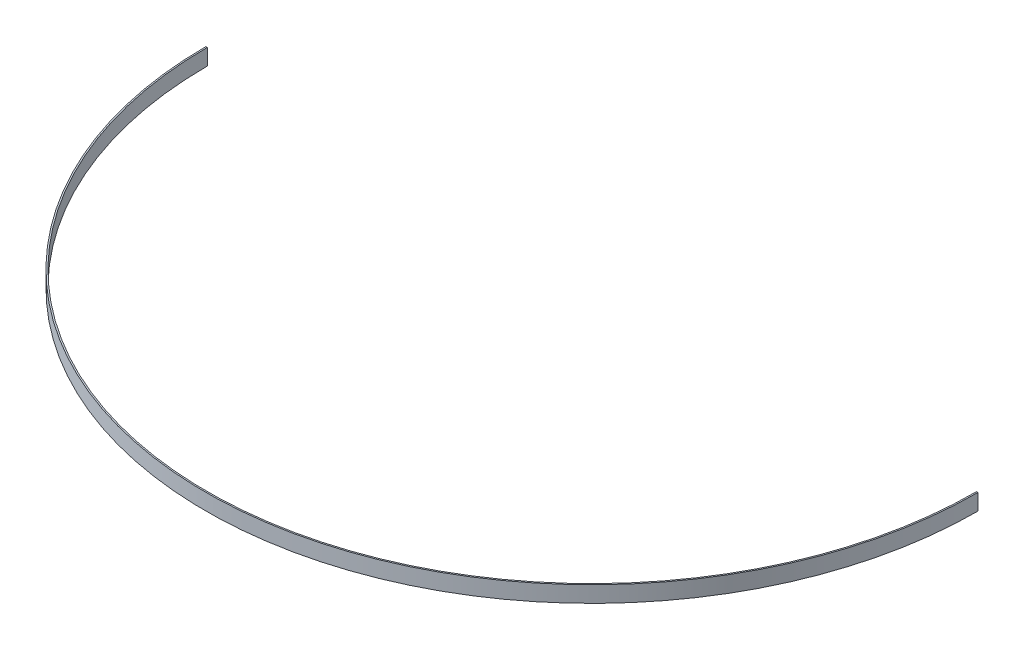
ISO-10303-21;
HEADER;
FILE_DESCRIPTION(('STEP AP214'),'2;1');
FILE_NAME('part.step','',(''),(''),'','','');
FILE_SCHEMA(('AUTOMOTIVE_DESIGN { 1 0 10303 214 1 1 1 1 }'));
ENDSEC;
DATA;
#1=APPLICATION_CONTEXT('core data for automotive mechanical design processes');
#2=APPLICATION_PROTOCOL_DEFINITION('international standard','automotive_design',2000,#1);
#3=PRODUCT_CONTEXT('',#1,'mechanical');
#4=PRODUCT('Part','Part','',(#3));
#5=PRODUCT_RELATED_PRODUCT_CATEGORY('part','',(#4));
#6=PRODUCT_DEFINITION_FORMATION('','',#4);
#7=PRODUCT_DEFINITION_CONTEXT('part definition',#1,'design');
#8=PRODUCT_DEFINITION('design','',#6,#7);
#9=PRODUCT_DEFINITION_SHAPE('','',#8);
#10=(LENGTH_UNIT() NAMED_UNIT(*) SI_UNIT(.MILLI.,.METRE.));
#11=(NAMED_UNIT(*) PLANE_ANGLE_UNIT() SI_UNIT($,.RADIAN.));
#12=(NAMED_UNIT(*) SI_UNIT($,.STERADIAN.) SOLID_ANGLE_UNIT());
#13=UNCERTAINTY_MEASURE_WITH_UNIT(LENGTH_MEASURE(1.E-05),#10,'distance_accuracy_value','');
#14=(GEOMETRIC_REPRESENTATION_CONTEXT(3) GLOBAL_UNCERTAINTY_ASSIGNED_CONTEXT((#13)) GLOBAL_UNIT_ASSIGNED_CONTEXT((#10,
#11,#12)) REPRESENTATION_CONTEXT('',''));
#15=CARTESIAN_POINT('',(0.,0.,0.));
#16=DIRECTION('',(0.,0.,1.));
#17=DIRECTION('',(1.,0.,0.));
#18=AXIS2_PLACEMENT_3D('',#15,#16,#17);
#19=CARTESIAN_POINT('',(0.,23.0000000000001,-3.34787818716908E-13));
#20=DIRECTION('',(0.,-1.,0.));
#21=DIRECTION('',(0.,0.,-1.));
#22=AXIS2_PLACEMENT_3D('',#19,#20,#21);
#23=PLANE('',#22);
#24=DIRECTION('',(1.,0.,0.));
#25=VECTOR('',#24,1.);
#26=CARTESIAN_POINT('',(-1093.5,23.0000000000001,-5.35660509947052E-13));
#27=LINE('',#26,#25);
#28=CARTESIAN_POINT('',(-1097.5,23.0000000000001,-1.33180339407275E-13));
#29=VERTEX_POINT('',#28);
#30=CARTESIAN_POINT('',(-1093.5,23.0000000000001,-5.35660509947052E-13));
#31=VERTEX_POINT('',#30);
#32=EDGE_CURVE('E11',#29,#31,#27,.T.);
#33=ORIENTED_EDGE('',*,*,#32,.F.);
#34=CARTESIAN_POINT('',(0.,23.0000000000001,-3.34787818716908E-13));
#35=DIRECTION('',(0.,-1.,0.));
#36=DIRECTION('',(0.,0.,-1.));
#37=AXIS2_PLACEMENT_3D('',#34,#35,#36);
#38=CIRCLE('',#37,1097.5);
#39=CARTESIAN_POINT('',(1097.5,23.0000000000001,-6.73803311335589E-12));
#40=VERTEX_POINT('',#39);
#41=EDGE_CURVE('E72',#29,#40,#38,.F.);
#42=ORIENTED_EDGE('',*,*,#41,.T.);
#43=DIRECTION('',(-1.,0.,0.));
#44=VECTOR('',#43,1.);
#45=CARTESIAN_POINT('',(1093.5,23.0000000000001,-7.06639196856813E-12));
#46=LINE('',#45,#44);
#47=CARTESIAN_POINT('',(1093.5,23.0000000000001,-7.06639196856813E-12));
#48=VERTEX_POINT('',#47);
#49=EDGE_CURVE('E46',#40,#48,#46,.T.);
#50=ORIENTED_EDGE('',*,*,#49,.T.);
#51=CARTESIAN_POINT('',(0.,23.0000000000001,-3.34787818716908E-13));
#52=DIRECTION('',(0.,1.,0.));
#53=DIRECTION('',(0.,0.,1.));
#54=AXIS2_PLACEMENT_3D('',#51,#52,#53);
#55=CIRCLE('',#54,1093.5);
#56=EDGE_CURVE('E75',#31,#48,#55,.T.);
#57=ORIENTED_EDGE('',*,*,#56,.F.);
#58=EDGE_LOOP('',(#33,#42,#50,#57));
#59=FACE_BOUND('',#58,.T.);
#60=ADVANCED_FACE('F36',(#59),#23,.F.);
#61=CARTESIAN_POINT('',(1093.5,0.,-6.71469554508385E-12));
#62=DIRECTION('',(0.,0.,1.));
#63=DIRECTION('',(0.,-1.,0.));
#64=AXIS2_PLACEMENT_3D('',#61,#62,#63);
#65=PLANE('',#64);
#66=ORIENTED_EDGE('',*,*,#49,.F.);
#67=DIRECTION('',(0.,-1.,0.));
#68=VECTOR('',#67,1.);
#69=CARTESIAN_POINT('',(1097.5,3439.07593674461,-6.73803311335589E-12));
#70=LINE('',#69,#68);
#71=CARTESIAN_POINT('',(1097.5,-23.0000000000001,-6.73803311335589E-12));
#72=VERTEX_POINT('',#71);
#73=EDGE_CURVE('E87',#40,#72,#70,.T.);
#74=ORIENTED_EDGE('',*,*,#73,.T.);
#75=DIRECTION('',(-1.,0.,0.));
#76=VECTOR('',#75,1.);
#77=CARTESIAN_POINT('',(1093.5,-23.0000000000001,-6.22908399411281E-12));
#78=LINE('',#77,#76);
#79=CARTESIAN_POINT('',(1093.5,-23.0000000000001,-6.22908399411281E-12));
#80=VERTEX_POINT('',#79);
#81=EDGE_CURVE('E96',#72,#80,#78,.T.);
#82=ORIENTED_EDGE('',*,*,#81,.T.);
#83=DIRECTION('',(0.,-1.,0.));
#84=VECTOR('',#83,1.);
#85=CARTESIAN_POINT('',(1093.5,23.0000000000001,-7.2003070960549E-12));
#86=LINE('',#85,#84);
#87=EDGE_CURVE('E91',#48,#80,#86,.T.);
#88=ORIENTED_EDGE('',*,*,#87,.F.);
#89=EDGE_LOOP('',(#66,#74,#82,#88));
#90=FACE_BOUND('',#89,.T.);
#91=ADVANCED_FACE('F104',(#90),#65,.F.);
#92=CARTESIAN_POINT('',(0.,-23.0000000000001,-3.34787818716908E-13));
#93=DIRECTION('',(0.,1.,0.));
#94=DIRECTION('',(0.,0.,1.));
#95=AXIS2_PLACEMENT_3D('',#92,#93,#94);
#96=PLANE('',#95);
#97=ORIENTED_EDGE('',*,*,#81,.F.);
#98=CARTESIAN_POINT('',(0.,-23.0000000000001,-3.34787818716908E-13));
#99=DIRECTION('',(0.,-1.,0.));
#100=DIRECTION('',(0.,0.,-1.));
#101=AXIS2_PLACEMENT_3D('',#98,#99,#100);
#102=CIRCLE('',#101,1097.5);
#103=CARTESIAN_POINT('',(-1097.5,-23.0000000000001,-1.33180339407275E-13));
#104=VERTEX_POINT('',#103);
#105=EDGE_CURVE('E89',#72,#104,#102,.T.);
#106=ORIENTED_EDGE('',*,*,#105,.T.);
#107=DIRECTION('',(1.,0.,0.));
#108=VECTOR('',#107,1.);
#109=CARTESIAN_POINT('',(-1093.5,-23.0000000000001,-1.33915127486763E-13));
#110=LINE('',#109,#108);
#111=CARTESIAN_POINT('',(-1093.5,-23.0000000000001,-1.33915127486763E-13));
#112=VERTEX_POINT('',#111);
#113=EDGE_CURVE('E40',#104,#112,#110,.T.);
#114=ORIENTED_EDGE('',*,*,#113,.T.);
#115=CARTESIAN_POINT('',(0.,-23.0000000000001,-3.34787818716908E-13));
#116=DIRECTION('',(0.,-1.,0.));
#117=DIRECTION('',(0.,0.,-1.));
#118=AXIS2_PLACEMENT_3D('',#115,#116,#117);
#119=CIRCLE('',#118,1093.5);
#120=EDGE_CURVE('E105',#80,#112,#119,.T.);
#121=ORIENTED_EDGE('',*,*,#120,.F.);
#122=EDGE_LOOP('',(#97,#106,#114,#121));
#123=FACE_BOUND('',#122,.T.);
#124=ADVANCED_FACE('F109',(#123),#96,.F.);
#125=CARTESIAN_POINT('',(-1093.5,0.,-1.33915127486763E-13));
#126=DIRECTION('',(0.,0.,1.));
#127=DIRECTION('',(0.,1.,0.));
#128=AXIS2_PLACEMENT_3D('',#125,#126,#127);
#129=PLANE('',#128);
#130=DIRECTION('',(0.,-1.,0.));
#131=VECTOR('',#130,1.);
#132=CARTESIAN_POINT('',(-1097.5,3439.07593674461,-1.33180339407275E-13));
#133=LINE('',#132,#131);
#134=EDGE_CURVE('E85',#104,#29,#133,.F.);
#135=ORIENTED_EDGE('',*,*,#134,.T.);
#136=ORIENTED_EDGE('',*,*,#32,.T.);
#137=DIRECTION('',(0.,1.,0.));
#138=VECTOR('',#137,1.);
#139=CARTESIAN_POINT('',(-1093.5,-23.0000000000001,-1.33915127486763E-13));
#140=LINE('',#139,#138);
#141=EDGE_CURVE('E103',#112,#31,#140,.T.);
#142=ORIENTED_EDGE('',*,*,#141,.F.);
#143=ORIENTED_EDGE('',*,*,#113,.F.);
#144=EDGE_LOOP('',(#135,#136,#142,#143));
#145=FACE_BOUND('',#144,.T.);
#146=ADVANCED_FACE('F38',(#145),#129,.F.);
#147=CARTESIAN_POINT('',(0.,3439.07593674461,-3.34787818716908E-13));
#148=DIRECTION('',(0.,-1.,0.));
#149=DIRECTION('',(0.,0.,-1.));
#150=AXIS2_PLACEMENT_3D('',#147,#148,#149);
#151=CYLINDRICAL_SURFACE('',#150,1093.5);
#152=ORIENTED_EDGE('',*,*,#120,.T.);
#153=ORIENTED_EDGE('',*,*,#141,.T.);
#154=ORIENTED_EDGE('',*,*,#56,.T.);
#155=ORIENTED_EDGE('',*,*,#87,.T.);
#156=EDGE_LOOP('',(#152,#153,#154,#155));
#157=FACE_BOUND('',#156,.T.);
#158=ADVANCED_FACE('F102',(#157),#151,.F.);
#159=CARTESIAN_POINT('',(0.,3439.07593674461,-3.34787818716908E-13));
#160=DIRECTION('',(0.,-1.,0.));
#161=DIRECTION('',(0.,0.,-1.));
#162=AXIS2_PLACEMENT_3D('',#159,#160,#161);
#163=CYLINDRICAL_SURFACE('',#162,1097.5);
#164=ORIENTED_EDGE('',*,*,#105,.F.);
#165=ORIENTED_EDGE('',*,*,#73,.F.);
#166=ORIENTED_EDGE('',*,*,#41,.F.);
#167=ORIENTED_EDGE('',*,*,#134,.F.);
#168=EDGE_LOOP('',(#164,#165,#166,#167));
#169=FACE_BOUND('',#168,.T.);
#170=ADVANCED_FACE('F84',(#169),#163,.T.);
#171=CLOSED_SHELL('',(#60,#91,#124,#146,#158,#170));
#172=MANIFOLD_SOLID_BREP('B2',#171);
#173=ADVANCED_BREP_SHAPE_REPRESENTATION('',(#18,#172),#14);
#174=SHAPE_DEFINITION_REPRESENTATION(#9,#173);
ENDSEC;
END-ISO-10303-21;
